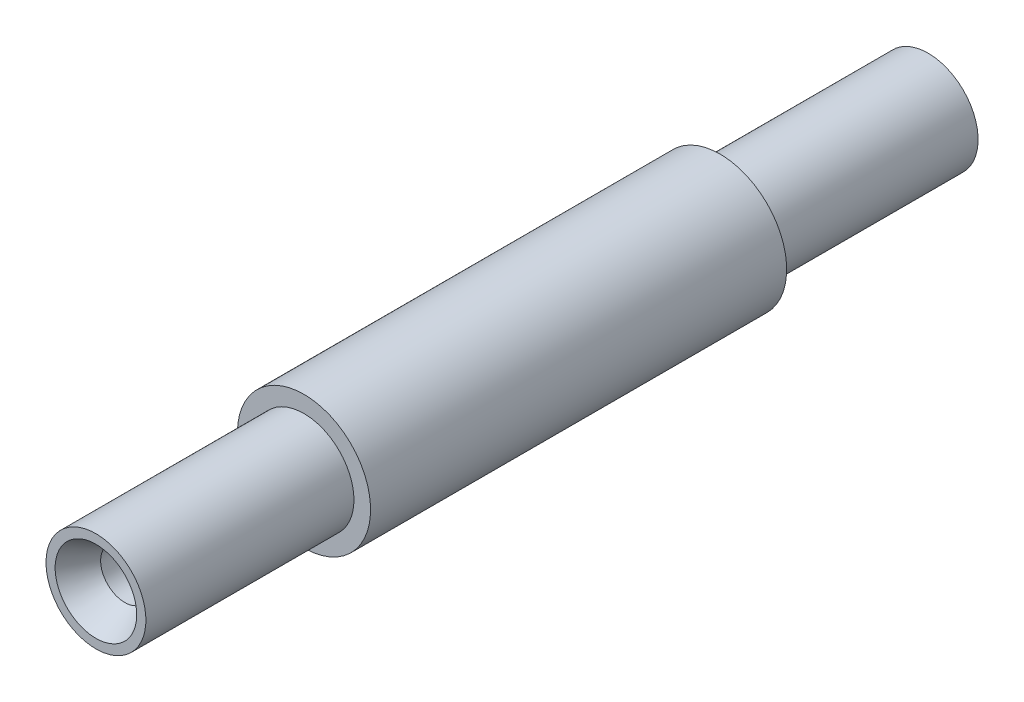
ISO-10303-21;
HEADER;
FILE_DESCRIPTION(('STEP AP214'),'2;1');
FILE_NAME('part.step','',(''),(''),'','','');
FILE_SCHEMA(('AUTOMOTIVE_DESIGN { 1 0 10303 214 1 1 1 1 }'));
ENDSEC;
DATA;
#1=APPLICATION_CONTEXT('core data for automotive mechanical design processes');
#2=APPLICATION_PROTOCOL_DEFINITION('international standard','automotive_design',2000,#1);
#3=PRODUCT_CONTEXT('',#1,'mechanical');
#4=PRODUCT('Part','Part','',(#3));
#5=PRODUCT_RELATED_PRODUCT_CATEGORY('part','',(#4));
#6=PRODUCT_DEFINITION_FORMATION('','',#4);
#7=PRODUCT_DEFINITION_CONTEXT('part definition',#1,'design');
#8=PRODUCT_DEFINITION('design','',#6,#7);
#9=PRODUCT_DEFINITION_SHAPE('','',#8);
#10=(LENGTH_UNIT() NAMED_UNIT(*) SI_UNIT(.MILLI.,.METRE.));
#11=(NAMED_UNIT(*) PLANE_ANGLE_UNIT() SI_UNIT($,.RADIAN.));
#12=(NAMED_UNIT(*) SI_UNIT($,.STERADIAN.) SOLID_ANGLE_UNIT());
#13=UNCERTAINTY_MEASURE_WITH_UNIT(LENGTH_MEASURE(1.E-05),#10,'distance_accuracy_value','');
#14=(GEOMETRIC_REPRESENTATION_CONTEXT(3) GLOBAL_UNCERTAINTY_ASSIGNED_CONTEXT((#13)) GLOBAL_UNIT_ASSIGNED_CONTEXT((#10,
#11,#12)) REPRESENTATION_CONTEXT('',''));
#15=CARTESIAN_POINT('',(0.,0.,0.));
#16=DIRECTION('',(0.,0.,1.));
#17=DIRECTION('',(1.,0.,0.));
#18=AXIS2_PLACEMENT_3D('',#15,#16,#17);
#19=CARTESIAN_POINT('',(0.,0.,8.));
#20=DIRECTION('',(0.,0.,-1.));
#21=DIRECTION('',(-1.,0.,0.));
#22=AXIS2_PLACEMENT_3D('',#19,#20,#21);
#23=CYLINDRICAL_SURFACE('',#22,4.);
#24=CARTESIAN_POINT('',(0.,0.,12.5));
#25=DIRECTION('',(0.,0.,-1.));
#26=DIRECTION('',(-1.,0.,0.));
#27=AXIS2_PLACEMENT_3D('',#24,#25,#26);
#28=CIRCLE('',#27,4.);
#29=CARTESIAN_POINT('',(-4.,0.,12.5));
#30=VERTEX_POINT('',#29);
#31=EDGE_CURVE('E68',#30,#30,#28,.T.);
#32=ORIENTED_EDGE('',*,*,#31,.F.);
#33=EDGE_LOOP('',(#32));
#34=FACE_BOUND('',#33,.T.);
#35=CARTESIAN_POINT('',(0.,0.,37.5));
#36=DIRECTION('',(0.,0.,-1.));
#37=DIRECTION('',(-1.,0.,0.));
#38=AXIS2_PLACEMENT_3D('',#35,#36,#37);
#39=CIRCLE('',#38,4.);
#40=CARTESIAN_POINT('',(-4.,0.,37.5));
#41=VERTEX_POINT('',#40);
#42=EDGE_CURVE('E73',#41,#41,#39,.T.);
#43=ORIENTED_EDGE('',*,*,#42,.T.);
#44=EDGE_LOOP('',(#43));
#45=FACE_BOUND('',#44,.T.);
#46=ADVANCED_FACE('F47',(#34,#45),#23,.T.);
#47=CARTESIAN_POINT('',(0.,0.,0.));
#48=DIRECTION('',(0.,0.,1.));
#49=DIRECTION('',(1.,0.,0.));
#50=AXIS2_PLACEMENT_3D('',#47,#48,#49);
#51=PLANE('',#50);
#52=CARTESIAN_POINT('',(0.,0.,0.));
#53=DIRECTION('',(0.,0.,1.));
#54=DIRECTION('',(1.,0.,0.));
#55=AXIS2_PLACEMENT_3D('',#52,#53,#54);
#56=CIRCLE('',#55,2.45);
#57=CARTESIAN_POINT('',(2.45,0.,0.));
#58=VERTEX_POINT('',#57);
#59=EDGE_CURVE('E63',#58,#58,#56,.T.);
#60=ORIENTED_EDGE('',*,*,#59,.T.);
#61=EDGE_LOOP('',(#60));
#62=FACE_BOUND('',#61,.T.);
#63=CARTESIAN_POINT('',(0.,0.,0.));
#64=DIRECTION('',(0.,0.,-1.));
#65=DIRECTION('',(-1.,0.,0.));
#66=AXIS2_PLACEMENT_3D('',#63,#64,#65);
#67=CIRCLE('',#66,3.);
#68=CARTESIAN_POINT('',(-3.,0.,0.));
#69=VERTEX_POINT('',#68);
#70=EDGE_CURVE('E69',#69,#69,#67,.T.);
#71=ORIENTED_EDGE('',*,*,#70,.T.);
#72=EDGE_LOOP('',(#71));
#73=FACE_BOUND('',#72,.T.);
#74=ADVANCED_FACE('F111',(#62,#73),#51,.F.);
#75=CARTESIAN_POINT('',(0.,0.,8.));
#76=DIRECTION('',(0.,0.,-1.));
#77=DIRECTION('',(-1.,0.,0.));
#78=AXIS2_PLACEMENT_3D('',#75,#76,#77);
#79=CYLINDRICAL_SURFACE('',#78,1.45);
#80=CARTESIAN_POINT('',(0.,0.,1.73205080756888));
#81=DIRECTION('',(0.,0.,1.));
#82=DIRECTION('',(1.,0.,0.));
#83=AXIS2_PLACEMENT_3D('',#80,#81,#82);
#84=CIRCLE('',#83,1.45);
#85=CARTESIAN_POINT('',(1.45,0.,1.73205080756888));
#86=VERTEX_POINT('',#85);
#87=EDGE_CURVE('E55',#86,#86,#84,.F.);
#88=ORIENTED_EDGE('',*,*,#87,.T.);
#89=EDGE_LOOP('',(#88));
#90=FACE_BOUND('',#89,.T.);
#91=CARTESIAN_POINT('',(0.,0.,48.2679491924311));
#92=DIRECTION('',(0.,0.,1.));
#93=DIRECTION('',(1.,0.,0.));
#94=AXIS2_PLACEMENT_3D('',#91,#92,#93);
#95=CIRCLE('',#94,1.45);
#96=CARTESIAN_POINT('',(1.45,0.,48.2679491924311));
#97=VERTEX_POINT('',#96);
#98=EDGE_CURVE('E59',#97,#97,#95,.T.);
#99=ORIENTED_EDGE('',*,*,#98,.T.);
#100=EDGE_LOOP('',(#99));
#101=FACE_BOUND('',#100,.T.);
#102=ADVANCED_FACE('F101',(#90,#101),#79,.F.);
#103=CARTESIAN_POINT('',(0.,0.,50.));
#104=DIRECTION('',(0.,0.,1.));
#105=DIRECTION('',(1.,0.,0.));
#106=AXIS2_PLACEMENT_3D('',#103,#104,#105);
#107=PLANE('',#106);
#108=CARTESIAN_POINT('',(0.,0.,50.));
#109=DIRECTION('',(0.,0.,1.));
#110=DIRECTION('',(1.,0.,0.));
#111=AXIS2_PLACEMENT_3D('',#108,#109,#110);
#112=CIRCLE('',#111,2.45);
#113=CARTESIAN_POINT('',(2.45,0.,50.));
#114=VERTEX_POINT('',#113);
#115=EDGE_CURVE('E11',#114,#114,#112,.F.);
#116=ORIENTED_EDGE('',*,*,#115,.T.);
#117=EDGE_LOOP('',(#116));
#118=FACE_BOUND('',#117,.T.);
#119=CARTESIAN_POINT('',(0.,0.,50.));
#120=DIRECTION('',(0.,0.,-1.));
#121=DIRECTION('',(-1.,0.,0.));
#122=AXIS2_PLACEMENT_3D('',#119,#120,#121);
#123=CIRCLE('',#122,3.);
#124=CARTESIAN_POINT('',(-3.,0.,50.));
#125=VERTEX_POINT('',#124);
#126=EDGE_CURVE('E79',#125,#125,#123,.T.);
#127=ORIENTED_EDGE('',*,*,#126,.F.);
#128=EDGE_LOOP('',(#127));
#129=FACE_BOUND('',#128,.T.);
#130=ADVANCED_FACE('F98',(#118,#129),#107,.T.);
#131=CARTESIAN_POINT('',(0.,0.,12.5));
#132=DIRECTION('',(0.,0.,-1.));
#133=DIRECTION('',(-1.,0.,0.));
#134=AXIS2_PLACEMENT_3D('',#131,#132,#133);
#135=CYLINDRICAL_SURFACE('',#134,3.);
#136=CARTESIAN_POINT('',(0.,0.,12.5));
#137=DIRECTION('',(0.,0.,-1.));
#138=DIRECTION('',(-1.,0.,0.));
#139=AXIS2_PLACEMENT_3D('',#136,#137,#138);
#140=CIRCLE('',#139,3.);
#141=CARTESIAN_POINT('',(-3.,0.,12.5));
#142=VERTEX_POINT('',#141);
#143=EDGE_CURVE('E72',#142,#142,#140,.T.);
#144=ORIENTED_EDGE('',*,*,#143,.T.);
#145=EDGE_LOOP('',(#144));
#146=FACE_BOUND('',#145,.T.);
#147=ORIENTED_EDGE('',*,*,#70,.F.);
#148=EDGE_LOOP('',(#147));
#149=FACE_BOUND('',#148,.T.);
#150=ADVANCED_FACE('F100',(#146,#149),#135,.T.);
#151=CARTESIAN_POINT('',(0.,0.,12.5));
#152=DIRECTION('',(0.,0.,-1.));
#153=DIRECTION('',(-1.,0.,0.));
#154=AXIS2_PLACEMENT_3D('',#151,#152,#153);
#155=PLANE('',#154);
#156=ORIENTED_EDGE('',*,*,#143,.F.);
#157=EDGE_LOOP('',(#156));
#158=FACE_BOUND('',#157,.T.);
#159=ORIENTED_EDGE('',*,*,#31,.T.);
#160=EDGE_LOOP('',(#159));
#161=FACE_BOUND('',#160,.T.);
#162=ADVANCED_FACE('F94',(#158,#161),#155,.T.);
#163=CARTESIAN_POINT('',(0.,0.,37.5));
#164=DIRECTION('',(0.,0.,1.));
#165=DIRECTION('',(1.,0.,0.));
#166=AXIS2_PLACEMENT_3D('',#163,#164,#165);
#167=CYLINDRICAL_SURFACE('',#166,3.);
#168=CARTESIAN_POINT('',(0.,0.,37.5));
#169=DIRECTION('',(0.,0.,-1.));
#170=DIRECTION('',(-1.,0.,0.));
#171=AXIS2_PLACEMENT_3D('',#168,#169,#170);
#172=CIRCLE('',#171,3.);
#173=CARTESIAN_POINT('',(-3.,0.,37.5));
#174=VERTEX_POINT('',#173);
#175=EDGE_CURVE('E82',#174,#174,#172,.T.);
#176=ORIENTED_EDGE('',*,*,#175,.F.);
#177=EDGE_LOOP('',(#176));
#178=FACE_BOUND('',#177,.T.);
#179=ORIENTED_EDGE('',*,*,#126,.T.);
#180=EDGE_LOOP('',(#179));
#181=FACE_BOUND('',#180,.T.);
#182=ADVANCED_FACE('F91',(#178,#181),#167,.T.);
#183=CARTESIAN_POINT('',(0.,0.,37.5));
#184=DIRECTION('',(0.,0.,1.));
#185=DIRECTION('',(-1.,0.,0.));
#186=AXIS2_PLACEMENT_3D('',#183,#184,#185);
#187=PLANE('',#186);
#188=ORIENTED_EDGE('',*,*,#175,.T.);
#189=EDGE_LOOP('',(#188));
#190=FACE_BOUND('',#189,.T.);
#191=ORIENTED_EDGE('',*,*,#42,.F.);
#192=EDGE_LOOP('',(#191));
#193=FACE_BOUND('',#192,.T.);
#194=ADVANCED_FACE('F88',(#190,#193),#187,.T.);
#195=CARTESIAN_POINT('',(0.,0.,0.));
#196=DIRECTION('',(0.,0.,-1.));
#197=DIRECTION('',(-1.,0.,0.));
#198=AXIS2_PLACEMENT_3D('',#195,#196,#197);
#199=CONICAL_SURFACE('',#198,2.45,0.5235987755983);
#200=ORIENTED_EDGE('',*,*,#87,.F.);
#201=EDGE_LOOP('',(#200));
#202=FACE_BOUND('',#201,.T.);
#203=ORIENTED_EDGE('',*,*,#59,.F.);
#204=EDGE_LOOP('',(#203));
#205=FACE_BOUND('',#204,.T.);
#206=ADVANCED_FACE('F123',(#202,#205),#199,.F.);
#207=CARTESIAN_POINT('',(0.,0.,50.));
#208=DIRECTION('',(0.,0.,1.));
#209=DIRECTION('',(1.,0.,0.));
#210=AXIS2_PLACEMENT_3D('',#207,#208,#209);
#211=CONICAL_SURFACE('',#210,2.45,0.523598775598304);
#212=ORIENTED_EDGE('',*,*,#98,.F.);
#213=EDGE_LOOP('',(#212));
#214=FACE_BOUND('',#213,.T.);
#215=ORIENTED_EDGE('',*,*,#115,.F.);
#216=EDGE_LOOP('',(#215));
#217=FACE_BOUND('',#216,.T.);
#218=ADVANCED_FACE('F50',(#214,#217),#211,.F.);
#219=CLOSED_SHELL('',(#46,#74,#102,#130,#150,#162,#182,#194,#206,#218));
#220=MANIFOLD_SOLID_BREP('B2',#219);
#221=ADVANCED_BREP_SHAPE_REPRESENTATION('',(#18,#220),#14);
#222=SHAPE_DEFINITION_REPRESENTATION(#9,#221);
ENDSEC;
END-ISO-10303-21;
